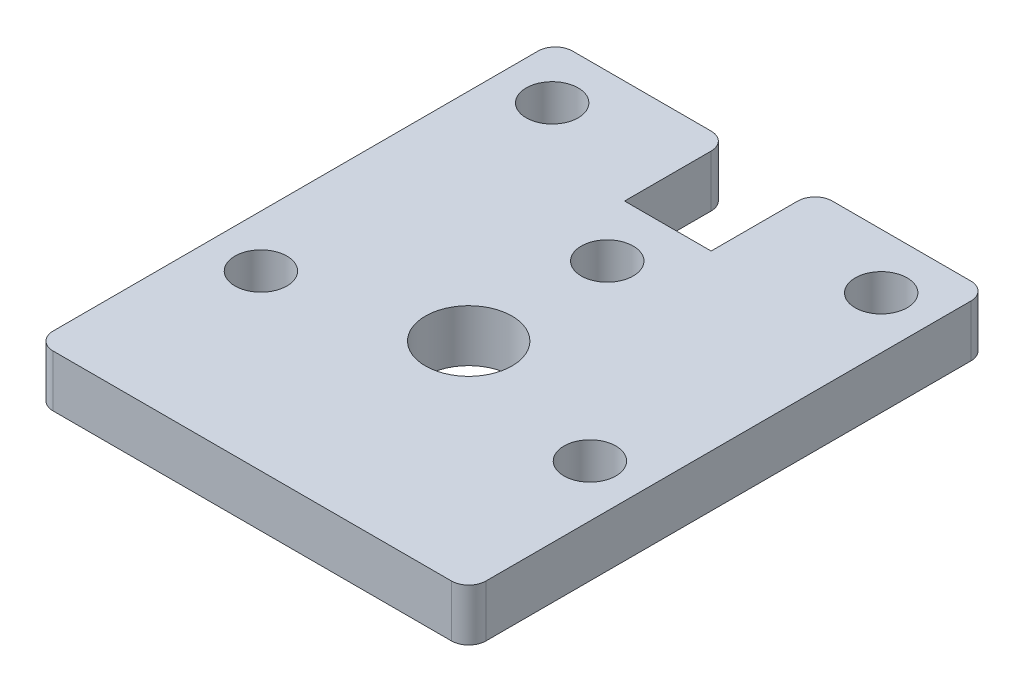
ISO-10303-21;
HEADER;
FILE_DESCRIPTION(('STEP AP214'),'2;1');
FILE_NAME('part.step','',(''),(''),'','','');
FILE_SCHEMA(('AUTOMOTIVE_DESIGN { 1 0 10303 214 1 1 1 1 }'));
ENDSEC;
DATA;
#1=APPLICATION_CONTEXT('core data for automotive mechanical design processes');
#2=APPLICATION_PROTOCOL_DEFINITION('international standard','automotive_design',2000,#1);
#3=PRODUCT_CONTEXT('',#1,'mechanical');
#4=PRODUCT('Part','Part','',(#3));
#5=PRODUCT_RELATED_PRODUCT_CATEGORY('part','',(#4));
#6=PRODUCT_DEFINITION_FORMATION('','',#4);
#7=PRODUCT_DEFINITION_CONTEXT('part definition',#1,'design');
#8=PRODUCT_DEFINITION('design','',#6,#7);
#9=PRODUCT_DEFINITION_SHAPE('','',#8);
#10=(LENGTH_UNIT() NAMED_UNIT(*) SI_UNIT(.MILLI.,.METRE.));
#11=(NAMED_UNIT(*) PLANE_ANGLE_UNIT() SI_UNIT($,.RADIAN.));
#12=(NAMED_UNIT(*) SI_UNIT($,.STERADIAN.) SOLID_ANGLE_UNIT());
#13=UNCERTAINTY_MEASURE_WITH_UNIT(LENGTH_MEASURE(1.E-05),#10,'distance_accuracy_value','');
#14=(GEOMETRIC_REPRESENTATION_CONTEXT(3) GLOBAL_UNCERTAINTY_ASSIGNED_CONTEXT((#13)) GLOBAL_UNIT_ASSIGNED_CONTEXT((#10,
#11,#12)) REPRESENTATION_CONTEXT('',''));
#15=CARTESIAN_POINT('',(0.,0.,0.));
#16=DIRECTION('',(0.,0.,1.));
#17=DIRECTION('',(1.,0.,0.));
#18=AXIS2_PLACEMENT_3D('',#15,#16,#17);
#19=CARTESIAN_POINT('',(0.,3.,0.));
#20=DIRECTION('',(0.,0.,1.));
#21=DIRECTION('',(1.,0.,0.));
#22=AXIS2_PLACEMENT_3D('',#19,#20,#21);
#23=PLANE('',#22);
#24=DIRECTION('',(-1.,0.,0.));
#25=VECTOR('',#24,1.);
#26=CARTESIAN_POINT('',(0.,0.,0.));
#27=LINE('',#26,#25);
#28=CARTESIAN_POINT('',(9.,0.,0.));
#29=VERTEX_POINT('',#28);
#30=CARTESIAN_POINT('',(1.,0.,0.));
#31=VERTEX_POINT('',#30);
#32=EDGE_CURVE('E267',#29,#31,#27,.T.);
#33=ORIENTED_EDGE('',*,*,#32,.T.);
#34=DIRECTION('',(0.,-1.,0.));
#35=VECTOR('',#34,1.);
#36=CARTESIAN_POINT('',(1.,3.,0.));
#37=LINE('',#36,#35);
#38=CARTESIAN_POINT('',(1.,3.,0.));
#39=VERTEX_POINT('',#38);
#40=EDGE_CURVE('E328',#31,#39,#37,.F.);
#41=ORIENTED_EDGE('',*,*,#40,.T.);
#42=DIRECTION('',(-1.,0.,0.));
#43=VECTOR('',#42,1.);
#44=CARTESIAN_POINT('',(0.,3.,0.));
#45=LINE('',#44,#43);
#46=CARTESIAN_POINT('',(9.,3.,0.));
#47=VERTEX_POINT('',#46);
#48=EDGE_CURVE('E251',#47,#39,#45,.T.);
#49=ORIENTED_EDGE('',*,*,#48,.F.);
#50=DIRECTION('',(0.,1.,0.));
#51=VECTOR('',#50,1.);
#52=CARTESIAN_POINT('',(9.,3.,0.));
#53=LINE('',#52,#51);
#54=EDGE_CURVE('E325',#47,#29,#53,.F.);
#55=ORIENTED_EDGE('',*,*,#54,.T.);
#56=EDGE_LOOP('',(#33,#41,#49,#55));
#57=FACE_BOUND('',#56,.T.);
#58=ADVANCED_FACE('F42',(#57),#23,.F.);
#59=CARTESIAN_POINT('',(0.,3.,0.));
#60=DIRECTION('',(0.,1.,0.));
#61=DIRECTION('',(0.,0.,1.));
#62=AXIS2_PLACEMENT_3D('',#59,#60,#61);
#63=PLANE('',#62);
#64=DIRECTION('',(0.,0.,1.));
#65=VECTOR('',#64,1.);
#66=CARTESIAN_POINT('',(0.,3.,0.));
#67=LINE('',#66,#65);
#68=CARTESIAN_POINT('',(0.,3.,1.));
#69=VERTEX_POINT('',#68);
#70=CARTESIAN_POINT('',(0.,3.,29.));
#71=VERTEX_POINT('',#70);
#72=EDGE_CURVE('E238',#69,#71,#67,.T.);
#73=ORIENTED_EDGE('',*,*,#72,.T.);
#74=CARTESIAN_POINT('',(1.,3.,29.));
#75=DIRECTION('',(0.,1.,0.));
#76=DIRECTION('',(0.,0.,1.));
#77=AXIS2_PLACEMENT_3D('',#74,#75,#76);
#78=CIRCLE('',#77,1.);
#79=CARTESIAN_POINT('',(1.,3.,30.));
#80=VERTEX_POINT('',#79);
#81=EDGE_CURVE('E315',#71,#80,#78,.T.);
#82=ORIENTED_EDGE('',*,*,#81,.T.);
#83=DIRECTION('',(1.,0.,0.));
#84=VECTOR('',#83,1.);
#85=CARTESIAN_POINT('',(0.,3.,30.));
#86=LINE('',#85,#84);
#87=CARTESIAN_POINT('',(24.,3.,30.));
#88=VERTEX_POINT('',#87);
#89=EDGE_CURVE('E242',#80,#88,#86,.T.);
#90=ORIENTED_EDGE('',*,*,#89,.T.);
#91=CARTESIAN_POINT('',(24.,3.,29.));
#92=DIRECTION('',(0.,1.,0.));
#93=DIRECTION('',(0.,0.,1.));
#94=AXIS2_PLACEMENT_3D('',#91,#92,#93);
#95=CIRCLE('',#94,1.);
#96=CARTESIAN_POINT('',(25.,3.,29.));
#97=VERTEX_POINT('',#96);
#98=EDGE_CURVE('E312',#88,#97,#95,.T.);
#99=ORIENTED_EDGE('',*,*,#98,.T.);
#100=DIRECTION('',(0.,0.,-1.));
#101=VECTOR('',#100,1.);
#102=CARTESIAN_POINT('',(25.,3.,0.));
#103=LINE('',#102,#101);
#104=CARTESIAN_POINT('',(25.,3.,1.));
#105=VERTEX_POINT('',#104);
#106=EDGE_CURVE('E247',#97,#105,#103,.T.);
#107=ORIENTED_EDGE('',*,*,#106,.T.);
#108=CARTESIAN_POINT('',(24.,3.,1.));
#109=DIRECTION('',(0.,1.,0.));
#110=DIRECTION('',(0.,0.,1.));
#111=AXIS2_PLACEMENT_3D('',#108,#109,#110);
#112=CIRCLE('',#111,1.);
#113=CARTESIAN_POINT('',(24.,3.,0.));
#114=VERTEX_POINT('',#113);
#115=EDGE_CURVE('E301',#105,#114,#112,.T.);
#116=ORIENTED_EDGE('',*,*,#115,.T.);
#117=CARTESIAN_POINT('',(16.,3.,0.));
#118=VERTEX_POINT('',#117);
#119=EDGE_CURVE('E252',#114,#118,#45,.T.);
#120=ORIENTED_EDGE('',*,*,#119,.T.);
#121=CARTESIAN_POINT('',(16.,3.,1.));
#122=DIRECTION('',(0.,1.,0.));
#123=DIRECTION('',(0.,0.,1.));
#124=AXIS2_PLACEMENT_3D('',#121,#122,#123);
#125=CIRCLE('',#124,1.);
#126=CARTESIAN_POINT('',(15.,3.,1.));
#127=VERTEX_POINT('',#126);
#128=EDGE_CURVE('E58',#118,#127,#125,.T.);
#129=ORIENTED_EDGE('',*,*,#128,.T.);
#130=DIRECTION('',(0.,0.,-1.));
#131=VECTOR('',#130,1.);
#132=CARTESIAN_POINT('',(15.,3.,0.));
#133=LINE('',#132,#131);
#134=CARTESIAN_POINT('',(15.,3.,6.));
#135=VERTEX_POINT('',#134);
#136=EDGE_CURVE('E159',#135,#127,#133,.T.);
#137=ORIENTED_EDGE('',*,*,#136,.F.);
#138=DIRECTION('',(1.,0.,0.));
#139=VECTOR('',#138,1.);
#140=CARTESIAN_POINT('',(10.,3.,6.));
#141=LINE('',#140,#139);
#142=CARTESIAN_POINT('',(10.,3.,6.));
#143=VERTEX_POINT('',#142);
#144=EDGE_CURVE('E182',#143,#135,#141,.T.);
#145=ORIENTED_EDGE('',*,*,#144,.F.);
#146=DIRECTION('',(0.,0.,1.));
#147=VECTOR('',#146,1.);
#148=CARTESIAN_POINT('',(10.,3.,0.));
#149=LINE('',#148,#147);
#150=CARTESIAN_POINT('',(10.,3.,0.999999999999999));
#151=VERTEX_POINT('',#150);
#152=EDGE_CURVE('E165',#151,#143,#149,.T.);
#153=ORIENTED_EDGE('',*,*,#152,.F.);
#154=CARTESIAN_POINT('',(9.,3.,1.));
#155=DIRECTION('',(0.,1.,0.));
#156=DIRECTION('',(0.,0.,1.));
#157=AXIS2_PLACEMENT_3D('',#154,#155,#156);
#158=CIRCLE('',#157,1.);
#159=EDGE_CURVE('E306',#151,#47,#158,.T.);
#160=ORIENTED_EDGE('',*,*,#159,.T.);
#161=ORIENTED_EDGE('',*,*,#48,.T.);
#162=CARTESIAN_POINT('',(1.,3.,1.));
#163=DIRECTION('',(0.,1.,0.));
#164=DIRECTION('',(0.,0.,1.));
#165=AXIS2_PLACEMENT_3D('',#162,#163,#164);
#166=CIRCLE('',#165,1.);
#167=EDGE_CURVE('E309',#39,#69,#166,.T.);
#168=ORIENTED_EDGE('',*,*,#167,.T.);
#169=EDGE_LOOP('',(#73,#82,#90,#99,#107,#116,#120,#129,#137,#145,#153,#160,#161,#168));
#170=FACE_BOUND('',#169,.T.);
#171=CARTESIAN_POINT('',(12.5,3.,9.5));
#172=DIRECTION('',(0.,1.,0.));
#173=DIRECTION('',(0.,0.,1.));
#174=AXIS2_PLACEMENT_3D('',#171,#172,#173);
#175=CIRCLE('',#174,1.5);
#176=CARTESIAN_POINT('',(12.5,3.,11.));
#177=VERTEX_POINT('',#176);
#178=EDGE_CURVE('E183',#177,#177,#175,.T.);
#179=ORIENTED_EDGE('',*,*,#178,.F.);
#180=EDGE_LOOP('',(#179));
#181=FACE_BOUND('',#180,.T.);
#182=CARTESIAN_POINT('',(12.5,3.,17.5));
#183=DIRECTION('',(0.,1.,0.));
#184=DIRECTION('',(0.,0.,1.));
#185=AXIS2_PLACEMENT_3D('',#182,#183,#184);
#186=CIRCLE('',#185,2.5);
#187=CARTESIAN_POINT('',(12.5,3.,20.));
#188=VERTEX_POINT('',#187);
#189=EDGE_CURVE('E198',#188,#188,#186,.T.);
#190=ORIENTED_EDGE('',*,*,#189,.F.);
#191=EDGE_LOOP('',(#190));
#192=FACE_BOUND('',#191,.T.);
#193=CARTESIAN_POINT('',(22.,3.,3.18));
#194=DIRECTION('',(0.,1.,0.));
#195=DIRECTION('',(0.,0.,1.));
#196=AXIS2_PLACEMENT_3D('',#193,#194,#195);
#197=CIRCLE('',#196,1.5);
#198=CARTESIAN_POINT('',(22.,3.,4.68));
#199=VERTEX_POINT('',#198);
#200=EDGE_CURVE('E214',#199,#199,#197,.T.);
#201=ORIENTED_EDGE('',*,*,#200,.F.);
#202=EDGE_LOOP('',(#201));
#203=FACE_BOUND('',#202,.T.);
#204=CARTESIAN_POINT('',(3.,3.,20.));
#205=DIRECTION('',(0.,1.,0.));
#206=DIRECTION('',(0.,0.,1.));
#207=AXIS2_PLACEMENT_3D('',#204,#205,#206);
#208=CIRCLE('',#207,1.5);
#209=CARTESIAN_POINT('',(3.,3.,21.5));
#210=VERTEX_POINT('',#209);
#211=EDGE_CURVE('E230',#210,#210,#208,.T.);
#212=ORIENTED_EDGE('',*,*,#211,.F.);
#213=EDGE_LOOP('',(#212));
#214=FACE_BOUND('',#213,.T.);
#215=CARTESIAN_POINT('',(22.,3.,20.));
#216=DIRECTION('',(0.,1.,0.));
#217=DIRECTION('',(0.,0.,1.));
#218=AXIS2_PLACEMENT_3D('',#215,#216,#217);
#219=CIRCLE('',#218,1.5);
#220=CARTESIAN_POINT('',(22.,3.,21.5));
#221=VERTEX_POINT('',#220);
#222=EDGE_CURVE('E222',#221,#221,#219,.T.);
#223=ORIENTED_EDGE('',*,*,#222,.F.);
#224=EDGE_LOOP('',(#223));
#225=FACE_BOUND('',#224,.T.);
#226=CARTESIAN_POINT('',(3.,3.,3.18));
#227=DIRECTION('',(0.,1.,0.));
#228=DIRECTION('',(0.,0.,1.));
#229=AXIS2_PLACEMENT_3D('',#226,#227,#228);
#230=CIRCLE('',#229,1.5);
#231=CARTESIAN_POINT('',(3.,3.,4.68));
#232=VERTEX_POINT('',#231);
#233=EDGE_CURVE('E206',#232,#232,#230,.T.);
#234=ORIENTED_EDGE('',*,*,#233,.F.);
#235=EDGE_LOOP('',(#234));
#236=FACE_BOUND('',#235,.T.);
#237=ADVANCED_FACE('F344',(#170,#181,#192,#203,#214,#225,#236),#63,.T.);
#238=CARTESIAN_POINT('',(0.,0.,0.));
#239=DIRECTION('',(0.,1.,0.));
#240=DIRECTION('',(0.,0.,1.));
#241=AXIS2_PLACEMENT_3D('',#238,#239,#240);
#242=PLANE('',#241);
#243=DIRECTION('',(1.,0.,0.));
#244=VECTOR('',#243,1.);
#245=CARTESIAN_POINT('',(0.,0.,30.));
#246=LINE('',#245,#244);
#247=CARTESIAN_POINT('',(1.,0.,30.));
#248=VERTEX_POINT('',#247);
#249=CARTESIAN_POINT('',(24.,0.,30.));
#250=VERTEX_POINT('',#249);
#251=EDGE_CURVE('E259',#248,#250,#246,.T.);
#252=ORIENTED_EDGE('',*,*,#251,.F.);
#253=CARTESIAN_POINT('',(1.,0.,29.));
#254=DIRECTION('',(0.,1.,0.));
#255=DIRECTION('',(0.,0.,1.));
#256=AXIS2_PLACEMENT_3D('',#253,#254,#255);
#257=CIRCLE('',#256,1.);
#258=CARTESIAN_POINT('',(0.,0.,29.));
#259=VERTEX_POINT('',#258);
#260=EDGE_CURVE('E291',#248,#259,#257,.F.);
#261=ORIENTED_EDGE('',*,*,#260,.T.);
#262=DIRECTION('',(0.,0.,1.));
#263=VECTOR('',#262,1.);
#264=CARTESIAN_POINT('',(0.,0.,0.));
#265=LINE('',#264,#263);
#266=CARTESIAN_POINT('',(0.,0.,1.));
#267=VERTEX_POINT('',#266);
#268=EDGE_CURVE('E234',#267,#259,#265,.T.);
#269=ORIENTED_EDGE('',*,*,#268,.F.);
#270=CARTESIAN_POINT('',(1.,0.,1.));
#271=DIRECTION('',(0.,1.,0.));
#272=DIRECTION('',(0.,0.,1.));
#273=AXIS2_PLACEMENT_3D('',#270,#271,#272);
#274=CIRCLE('',#273,1.);
#275=EDGE_CURVE('E285',#267,#31,#274,.F.);
#276=ORIENTED_EDGE('',*,*,#275,.T.);
#277=ORIENTED_EDGE('',*,*,#32,.F.);
#278=CARTESIAN_POINT('',(9.,0.,1.));
#279=DIRECTION('',(0.,1.,0.));
#280=DIRECTION('',(0.,0.,1.));
#281=AXIS2_PLACEMENT_3D('',#278,#279,#280);
#282=CIRCLE('',#281,1.);
#283=CARTESIAN_POINT('',(10.,0.,0.999999999999999));
#284=VERTEX_POINT('',#283);
#285=EDGE_CURVE('E154',#29,#284,#282,.F.);
#286=ORIENTED_EDGE('',*,*,#285,.T.);
#287=DIRECTION('',(0.,0.,1.));
#288=VECTOR('',#287,1.);
#289=CARTESIAN_POINT('',(10.,0.,0.));
#290=LINE('',#289,#288);
#291=CARTESIAN_POINT('',(10.,0.,6.));
#292=VERTEX_POINT('',#291);
#293=EDGE_CURVE('E144',#284,#292,#290,.T.);
#294=ORIENTED_EDGE('',*,*,#293,.T.);
#295=DIRECTION('',(1.,0.,0.));
#296=VECTOR('',#295,1.);
#297=CARTESIAN_POINT('',(10.,0.,6.));
#298=LINE('',#297,#296);
#299=CARTESIAN_POINT('',(15.,0.,6.));
#300=VERTEX_POINT('',#299);
#301=EDGE_CURVE('E151',#292,#300,#298,.T.);
#302=ORIENTED_EDGE('',*,*,#301,.T.);
#303=DIRECTION('',(0.,0.,-1.));
#304=VECTOR('',#303,1.);
#305=CARTESIAN_POINT('',(15.,0.,0.));
#306=LINE('',#305,#304);
#307=CARTESIAN_POINT('',(15.,0.,1.));
#308=VERTEX_POINT('',#307);
#309=EDGE_CURVE('E171',#300,#308,#306,.T.);
#310=ORIENTED_EDGE('',*,*,#309,.T.);
#311=CARTESIAN_POINT('',(16.,0.,1.));
#312=DIRECTION('',(0.,1.,0.));
#313=DIRECTION('',(0.,0.,1.));
#314=AXIS2_PLACEMENT_3D('',#311,#312,#313);
#315=CIRCLE('',#314,1.);
#316=CARTESIAN_POINT('',(16.,0.,0.));
#317=VERTEX_POINT('',#316);
#318=EDGE_CURVE('E280',#308,#317,#315,.F.);
#319=ORIENTED_EDGE('',*,*,#318,.T.);
#320=CARTESIAN_POINT('',(24.,0.,0.));
#321=VERTEX_POINT('',#320);
#322=EDGE_CURVE('E243',#321,#317,#27,.T.);
#323=ORIENTED_EDGE('',*,*,#322,.F.);
#324=CARTESIAN_POINT('',(24.,0.,1.));
#325=DIRECTION('',(0.,1.,0.));
#326=DIRECTION('',(0.,0.,1.));
#327=AXIS2_PLACEMENT_3D('',#324,#325,#326);
#328=CIRCLE('',#327,1.);
#329=CARTESIAN_POINT('',(25.,0.,1.));
#330=VERTEX_POINT('',#329);
#331=EDGE_CURVE('E277',#321,#330,#328,.F.);
#332=ORIENTED_EDGE('',*,*,#331,.T.);
#333=DIRECTION('',(0.,0.,-1.));
#334=VECTOR('',#333,1.);
#335=CARTESIAN_POINT('',(25.,0.,0.));
#336=LINE('',#335,#334);
#337=CARTESIAN_POINT('',(25.,0.,29.));
#338=VERTEX_POINT('',#337);
#339=EDGE_CURVE('E263',#338,#330,#336,.T.);
#340=ORIENTED_EDGE('',*,*,#339,.F.);
#341=CARTESIAN_POINT('',(24.,0.,29.));
#342=DIRECTION('',(0.,1.,0.));
#343=DIRECTION('',(0.,0.,1.));
#344=AXIS2_PLACEMENT_3D('',#341,#342,#343);
#345=CIRCLE('',#344,1.);
#346=EDGE_CURVE('E288',#338,#250,#345,.F.);
#347=ORIENTED_EDGE('',*,*,#346,.T.);
#348=EDGE_LOOP('',(#252,#261,#269,#276,#277,#286,#294,#302,#310,#319,#323,#332,#340,#347));
#349=FACE_BOUND('',#348,.T.);
#350=CARTESIAN_POINT('',(12.5,0.,9.5));
#351=DIRECTION('',(0.,1.,0.));
#352=DIRECTION('',(0.,0.,1.));
#353=AXIS2_PLACEMENT_3D('',#350,#351,#352);
#354=CIRCLE('',#353,1.5);
#355=CARTESIAN_POINT('',(12.5,0.,11.));
#356=VERTEX_POINT('',#355);
#357=EDGE_CURVE('E194',#356,#356,#354,.T.);
#358=ORIENTED_EDGE('',*,*,#357,.T.);
#359=EDGE_LOOP('',(#358));
#360=FACE_BOUND('',#359,.T.);
#361=CARTESIAN_POINT('',(12.5,0.,17.5));
#362=DIRECTION('',(0.,1.,0.));
#363=DIRECTION('',(0.,0.,1.));
#364=AXIS2_PLACEMENT_3D('',#361,#362,#363);
#365=CIRCLE('',#364,2.5);
#366=CARTESIAN_POINT('',(12.5,0.,20.));
#367=VERTEX_POINT('',#366);
#368=EDGE_CURVE('E202',#367,#367,#365,.T.);
#369=ORIENTED_EDGE('',*,*,#368,.T.);
#370=EDGE_LOOP('',(#369));
#371=FACE_BOUND('',#370,.T.);
#372=CARTESIAN_POINT('',(3.,0.,20.));
#373=DIRECTION('',(0.,1.,0.));
#374=DIRECTION('',(0.,0.,1.));
#375=AXIS2_PLACEMENT_3D('',#372,#373,#374);
#376=CIRCLE('',#375,1.5);
#377=CARTESIAN_POINT('',(3.,0.,21.5));
#378=VERTEX_POINT('',#377);
#379=EDGE_CURVE('E226',#378,#378,#376,.T.);
#380=ORIENTED_EDGE('',*,*,#379,.T.);
#381=EDGE_LOOP('',(#380));
#382=FACE_BOUND('',#381,.T.);
#383=CARTESIAN_POINT('',(22.,0.,20.));
#384=DIRECTION('',(0.,1.,0.));
#385=DIRECTION('',(0.,0.,1.));
#386=AXIS2_PLACEMENT_3D('',#383,#384,#385);
#387=CIRCLE('',#386,1.5);
#388=CARTESIAN_POINT('',(22.,0.,21.5));
#389=VERTEX_POINT('',#388);
#390=EDGE_CURVE('E218',#389,#389,#387,.T.);
#391=ORIENTED_EDGE('',*,*,#390,.T.);
#392=EDGE_LOOP('',(#391));
#393=FACE_BOUND('',#392,.T.);
#394=CARTESIAN_POINT('',(22.,0.,3.18));
#395=DIRECTION('',(0.,1.,0.));
#396=DIRECTION('',(0.,0.,1.));
#397=AXIS2_PLACEMENT_3D('',#394,#395,#396);
#398=CIRCLE('',#397,1.5);
#399=CARTESIAN_POINT('',(22.,0.,4.68));
#400=VERTEX_POINT('',#399);
#401=EDGE_CURVE('E210',#400,#400,#398,.T.);
#402=ORIENTED_EDGE('',*,*,#401,.T.);
#403=EDGE_LOOP('',(#402));
#404=FACE_BOUND('',#403,.T.);
#405=CARTESIAN_POINT('',(3.,0.,3.18));
#406=DIRECTION('',(0.,1.,0.));
#407=DIRECTION('',(0.,0.,1.));
#408=AXIS2_PLACEMENT_3D('',#405,#406,#407);
#409=CIRCLE('',#408,1.5);
#410=CARTESIAN_POINT('',(3.,0.,4.68));
#411=VERTEX_POINT('',#410);
#412=EDGE_CURVE('E189',#411,#411,#409,.T.);
#413=ORIENTED_EDGE('',*,*,#412,.T.);
#414=EDGE_LOOP('',(#413));
#415=FACE_BOUND('',#414,.T.);
#416=ADVANCED_FACE('F147',(#349,#360,#371,#382,#393,#404,#415),#242,.F.);
#417=CARTESIAN_POINT('',(0.,3.,0.));
#418=DIRECTION('',(1.,0.,0.));
#419=DIRECTION('',(0.,0.,-1.));
#420=AXIS2_PLACEMENT_3D('',#417,#418,#419);
#421=PLANE('',#420);
#422=ORIENTED_EDGE('',*,*,#268,.T.);
#423=DIRECTION('',(0.,-1.,0.));
#424=VECTOR('',#423,1.);
#425=CARTESIAN_POINT('',(0.,3.,29.));
#426=LINE('',#425,#424);
#427=EDGE_CURVE('E298',#259,#71,#426,.F.);
#428=ORIENTED_EDGE('',*,*,#427,.T.);
#429=ORIENTED_EDGE('',*,*,#72,.F.);
#430=DIRECTION('',(0.,-1.,0.));
#431=VECTOR('',#430,1.);
#432=CARTESIAN_POINT('',(0.,3.,1.));
#433=LINE('',#432,#431);
#434=EDGE_CURVE('E294',#69,#267,#433,.T.);
#435=ORIENTED_EDGE('',*,*,#434,.T.);
#436=EDGE_LOOP('',(#422,#428,#429,#435));
#437=FACE_BOUND('',#436,.T.);
#438=ADVANCED_FACE('F399',(#437),#421,.F.);
#439=CARTESIAN_POINT('',(0.,3.,30.));
#440=DIRECTION('',(0.,0.,-1.));
#441=DIRECTION('',(-1.,0.,0.));
#442=AXIS2_PLACEMENT_3D('',#439,#440,#441);
#443=PLANE('',#442);
#444=ORIENTED_EDGE('',*,*,#89,.F.);
#445=DIRECTION('',(0.,-1.,0.));
#446=VECTOR('',#445,1.);
#447=CARTESIAN_POINT('',(1.,3.,30.));
#448=LINE('',#447,#446);
#449=EDGE_CURVE('E273',#80,#248,#448,.T.);
#450=ORIENTED_EDGE('',*,*,#449,.T.);
#451=ORIENTED_EDGE('',*,*,#251,.T.);
#452=DIRECTION('',(0.,-1.,0.));
#453=VECTOR('',#452,1.);
#454=CARTESIAN_POINT('',(24.,3.,30.));
#455=LINE('',#454,#453);
#456=EDGE_CURVE('E255',#250,#88,#455,.F.);
#457=ORIENTED_EDGE('',*,*,#456,.T.);
#458=EDGE_LOOP('',(#444,#450,#451,#457));
#459=FACE_BOUND('',#458,.T.);
#460=ADVANCED_FACE('F394',(#459),#443,.F.);
#461=CARTESIAN_POINT('',(25.,3.,0.));
#462=DIRECTION('',(-1.,0.,0.));
#463=DIRECTION('',(0.,0.,1.));
#464=AXIS2_PLACEMENT_3D('',#461,#462,#463);
#465=PLANE('',#464);
#466=ORIENTED_EDGE('',*,*,#106,.F.);
#467=DIRECTION('',(0.,-1.,0.));
#468=VECTOR('',#467,1.);
#469=CARTESIAN_POINT('',(25.,3.,29.));
#470=LINE('',#469,#468);
#471=EDGE_CURVE('E321',#97,#338,#470,.T.);
#472=ORIENTED_EDGE('',*,*,#471,.T.);
#473=ORIENTED_EDGE('',*,*,#339,.T.);
#474=DIRECTION('',(0.,-1.,0.));
#475=VECTOR('',#474,1.);
#476=CARTESIAN_POINT('',(25.,3.,1.));
#477=LINE('',#476,#475);
#478=EDGE_CURVE('E318',#330,#105,#477,.F.);
#479=ORIENTED_EDGE('',*,*,#478,.T.);
#480=EDGE_LOOP('',(#466,#472,#473,#479));
#481=FACE_BOUND('',#480,.T.);
#482=ADVANCED_FACE('F385',(#481),#465,.F.);
#483=ORIENTED_EDGE('',*,*,#322,.T.);
#484=DIRECTION('',(0.,1.,0.));
#485=VECTOR('',#484,1.);
#486=CARTESIAN_POINT('',(16.,3.,0.));
#487=LINE('',#486,#485);
#488=EDGE_CURVE('E51',#317,#118,#487,.T.);
#489=ORIENTED_EDGE('',*,*,#488,.T.);
#490=ORIENTED_EDGE('',*,*,#119,.F.);
#491=DIRECTION('',(0.,-1.,0.));
#492=VECTOR('',#491,1.);
#493=CARTESIAN_POINT('',(24.,3.,0.));
#494=LINE('',#493,#492);
#495=EDGE_CURVE('E334',#114,#321,#494,.T.);
#496=ORIENTED_EDGE('',*,*,#495,.T.);
#497=EDGE_LOOP('',(#483,#489,#490,#496));
#498=FACE_BOUND('',#497,.T.);
#499=ADVANCED_FACE('F340',(#498),#23,.F.);
#500=CARTESIAN_POINT('',(3.,3.,20.));
#501=DIRECTION('',(0.,-1.,0.));
#502=DIRECTION('',(0.,0.,-1.));
#503=AXIS2_PLACEMENT_3D('',#500,#501,#502);
#504=CYLINDRICAL_SURFACE('',#503,1.5);
#505=ORIENTED_EDGE('',*,*,#211,.T.);
#506=EDGE_LOOP('',(#505));
#507=FACE_BOUND('',#506,.T.);
#508=ORIENTED_EDGE('',*,*,#379,.F.);
#509=EDGE_LOOP('',(#508));
#510=FACE_BOUND('',#509,.T.);
#511=ADVANCED_FACE('F384',(#507,#510),#504,.F.);
#512=CARTESIAN_POINT('',(22.,3.,20.));
#513=DIRECTION('',(0.,-1.,0.));
#514=DIRECTION('',(0.,0.,-1.));
#515=AXIS2_PLACEMENT_3D('',#512,#513,#514);
#516=CYLINDRICAL_SURFACE('',#515,1.5);
#517=ORIENTED_EDGE('',*,*,#222,.T.);
#518=EDGE_LOOP('',(#517));
#519=FACE_BOUND('',#518,.T.);
#520=ORIENTED_EDGE('',*,*,#390,.F.);
#521=EDGE_LOOP('',(#520));
#522=FACE_BOUND('',#521,.T.);
#523=ADVANCED_FACE('F391',(#519,#522),#516,.F.);
#524=CARTESIAN_POINT('',(22.,3.,3.18));
#525=DIRECTION('',(0.,-1.,0.));
#526=DIRECTION('',(0.,0.,-1.));
#527=AXIS2_PLACEMENT_3D('',#524,#525,#526);
#528=CYLINDRICAL_SURFACE('',#527,1.5);
#529=ORIENTED_EDGE('',*,*,#200,.T.);
#530=EDGE_LOOP('',(#529));
#531=FACE_BOUND('',#530,.T.);
#532=ORIENTED_EDGE('',*,*,#401,.F.);
#533=EDGE_LOOP('',(#532));
#534=FACE_BOUND('',#533,.T.);
#535=ADVANCED_FACE('F524',(#531,#534),#528,.F.);
#536=CARTESIAN_POINT('',(3.,3.,3.18));
#537=DIRECTION('',(0.,-1.,0.));
#538=DIRECTION('',(0.,0.,-1.));
#539=AXIS2_PLACEMENT_3D('',#536,#537,#538);
#540=CYLINDRICAL_SURFACE('',#539,1.5);
#541=ORIENTED_EDGE('',*,*,#233,.T.);
#542=EDGE_LOOP('',(#541));
#543=FACE_BOUND('',#542,.T.);
#544=ORIENTED_EDGE('',*,*,#412,.F.);
#545=EDGE_LOOP('',(#544));
#546=FACE_BOUND('',#545,.T.);
#547=ADVANCED_FACE('F508',(#543,#546),#540,.F.);
#548=CARTESIAN_POINT('',(10.,0.,0.));
#549=DIRECTION('',(-1.,0.,0.));
#550=DIRECTION('',(0.,0.,1.));
#551=AXIS2_PLACEMENT_3D('',#548,#549,#550);
#552=PLANE('',#551);
#553=ORIENTED_EDGE('',*,*,#293,.F.);
#554=DIRECTION('',(0.,1.,0.));
#555=VECTOR('',#554,1.);
#556=CARTESIAN_POINT('',(10.,0.,1.));
#557=LINE('',#556,#555);
#558=EDGE_CURVE('E331',#284,#151,#557,.T.);
#559=ORIENTED_EDGE('',*,*,#558,.T.);
#560=ORIENTED_EDGE('',*,*,#152,.T.);
#561=DIRECTION('',(0.,1.,0.));
#562=VECTOR('',#561,1.);
#563=CARTESIAN_POINT('',(10.,0.,6.));
#564=LINE('',#563,#562);
#565=EDGE_CURVE('E162',#292,#143,#564,.T.);
#566=ORIENTED_EDGE('',*,*,#565,.F.);
#567=EDGE_LOOP('',(#553,#559,#560,#566));
#568=FACE_BOUND('',#567,.T.);
#569=ADVANCED_FACE('F163',(#568),#552,.F.);
#570=CARTESIAN_POINT('',(15.,0.,0.));
#571=DIRECTION('',(1.,0.,0.));
#572=DIRECTION('',(0.,0.,-1.));
#573=AXIS2_PLACEMENT_3D('',#570,#571,#572);
#574=PLANE('',#573);
#575=ORIENTED_EDGE('',*,*,#136,.T.);
#576=DIRECTION('',(0.,1.,0.));
#577=VECTOR('',#576,1.);
#578=CARTESIAN_POINT('',(15.,0.,1.));
#579=LINE('',#578,#577);
#580=EDGE_CURVE('E11',#127,#308,#579,.F.);
#581=ORIENTED_EDGE('',*,*,#580,.T.);
#582=ORIENTED_EDGE('',*,*,#309,.F.);
#583=DIRECTION('',(0.,1.,0.));
#584=VECTOR('',#583,1.);
#585=CARTESIAN_POINT('',(15.,0.,6.));
#586=LINE('',#585,#584);
#587=EDGE_CURVE('E170',#300,#135,#586,.T.);
#588=ORIENTED_EDGE('',*,*,#587,.T.);
#589=EDGE_LOOP('',(#575,#581,#582,#588));
#590=FACE_BOUND('',#589,.T.);
#591=ADVANCED_FACE('F353',(#590),#574,.F.);
#592=CARTESIAN_POINT('',(10.,0.,6.));
#593=DIRECTION('',(0.,0.,1.));
#594=DIRECTION('',(1.,0.,0.));
#595=AXIS2_PLACEMENT_3D('',#592,#593,#594);
#596=PLANE('',#595);
#597=ORIENTED_EDGE('',*,*,#144,.T.);
#598=ORIENTED_EDGE('',*,*,#587,.F.);
#599=ORIENTED_EDGE('',*,*,#301,.F.);
#600=ORIENTED_EDGE('',*,*,#565,.T.);
#601=EDGE_LOOP('',(#597,#598,#599,#600));
#602=FACE_BOUND('',#601,.T.);
#603=ADVANCED_FACE('F173',(#602),#596,.F.);
#604=CARTESIAN_POINT('',(12.5,0.,17.5));
#605=DIRECTION('',(0.,1.,0.));
#606=DIRECTION('',(0.,0.,1.));
#607=AXIS2_PLACEMENT_3D('',#604,#605,#606);
#608=CYLINDRICAL_SURFACE('',#607,2.5);
#609=ORIENTED_EDGE('',*,*,#368,.F.);
#610=EDGE_LOOP('',(#609));
#611=FACE_BOUND('',#610,.T.);
#612=ORIENTED_EDGE('',*,*,#189,.T.);
#613=EDGE_LOOP('',(#612));
#614=FACE_BOUND('',#613,.T.);
#615=ADVANCED_FACE('F475',(#611,#614),#608,.F.);
#616=CARTESIAN_POINT('',(12.5,0.,9.5));
#617=DIRECTION('',(0.,1.,0.));
#618=DIRECTION('',(0.,0.,1.));
#619=AXIS2_PLACEMENT_3D('',#616,#617,#618);
#620=CYLINDRICAL_SURFACE('',#619,1.5);
#621=ORIENTED_EDGE('',*,*,#357,.F.);
#622=EDGE_LOOP('',(#621));
#623=FACE_BOUND('',#622,.T.);
#624=ORIENTED_EDGE('',*,*,#178,.T.);
#625=EDGE_LOOP('',(#624));
#626=FACE_BOUND('',#625,.T.);
#627=ADVANCED_FACE('F409',(#623,#626),#620,.F.);
#628=CARTESIAN_POINT('',(1.,3.,29.));
#629=DIRECTION('',(0.,-1.,0.));
#630=DIRECTION('',(0.,0.,-1.));
#631=AXIS2_PLACEMENT_3D('',#628,#629,#630);
#632=CYLINDRICAL_SURFACE('',#631,1.);
#633=ORIENTED_EDGE('',*,*,#81,.F.);
#634=ORIENTED_EDGE('',*,*,#427,.F.);
#635=ORIENTED_EDGE('',*,*,#260,.F.);
#636=ORIENTED_EDGE('',*,*,#449,.F.);
#637=EDGE_LOOP('',(#633,#634,#635,#636));
#638=FACE_BOUND('',#637,.T.);
#639=ADVANCED_FACE('F406',(#638),#632,.T.);
#640=CARTESIAN_POINT('',(24.,3.,29.));
#641=DIRECTION('',(0.,-1.,0.));
#642=DIRECTION('',(0.,0.,-1.));
#643=AXIS2_PLACEMENT_3D('',#640,#641,#642);
#644=CYLINDRICAL_SURFACE('',#643,1.);
#645=ORIENTED_EDGE('',*,*,#98,.F.);
#646=ORIENTED_EDGE('',*,*,#456,.F.);
#647=ORIENTED_EDGE('',*,*,#346,.F.);
#648=ORIENTED_EDGE('',*,*,#471,.F.);
#649=EDGE_LOOP('',(#645,#646,#647,#648));
#650=FACE_BOUND('',#649,.T.);
#651=ADVANCED_FACE('F371',(#650),#644,.T.);
#652=CARTESIAN_POINT('',(1.,3.,1.));
#653=DIRECTION('',(0.,-1.,0.));
#654=DIRECTION('',(0.,0.,-1.));
#655=AXIS2_PLACEMENT_3D('',#652,#653,#654);
#656=CYLINDRICAL_SURFACE('',#655,1.);
#657=ORIENTED_EDGE('',*,*,#167,.F.);
#658=ORIENTED_EDGE('',*,*,#40,.F.);
#659=ORIENTED_EDGE('',*,*,#275,.F.);
#660=ORIENTED_EDGE('',*,*,#434,.F.);
#661=EDGE_LOOP('',(#657,#658,#659,#660));
#662=FACE_BOUND('',#661,.T.);
#663=ADVANCED_FACE('F365',(#662),#656,.T.);
#664=CARTESIAN_POINT('',(9.,0.,1.));
#665=DIRECTION('',(0.,1.,0.));
#666=DIRECTION('',(0.,0.,1.));
#667=AXIS2_PLACEMENT_3D('',#664,#665,#666);
#668=CYLINDRICAL_SURFACE('',#667,1.);
#669=ORIENTED_EDGE('',*,*,#285,.F.);
#670=ORIENTED_EDGE('',*,*,#54,.F.);
#671=ORIENTED_EDGE('',*,*,#159,.F.);
#672=ORIENTED_EDGE('',*,*,#558,.F.);
#673=EDGE_LOOP('',(#669,#670,#671,#672));
#674=FACE_BOUND('',#673,.T.);
#675=ADVANCED_FACE('F363',(#674),#668,.T.);
#676=CARTESIAN_POINT('',(16.,3.,1.));
#677=DIRECTION('',(0.,1.,0.));
#678=DIRECTION('',(0.,0.,1.));
#679=AXIS2_PLACEMENT_3D('',#676,#677,#678);
#680=CYLINDRICAL_SURFACE('',#679,1.);
#681=ORIENTED_EDGE('',*,*,#318,.F.);
#682=ORIENTED_EDGE('',*,*,#580,.F.);
#683=ORIENTED_EDGE('',*,*,#128,.F.);
#684=ORIENTED_EDGE('',*,*,#488,.F.);
#685=EDGE_LOOP('',(#681,#682,#683,#684));
#686=FACE_BOUND('',#685,.T.);
#687=ADVANCED_FACE('F351',(#686),#680,.T.);
#688=CARTESIAN_POINT('',(24.,3.,1.));
#689=DIRECTION('',(0.,-1.,0.));
#690=DIRECTION('',(0.,0.,-1.));
#691=AXIS2_PLACEMENT_3D('',#688,#689,#690);
#692=CYLINDRICAL_SURFACE('',#691,1.);
#693=ORIENTED_EDGE('',*,*,#115,.F.);
#694=ORIENTED_EDGE('',*,*,#478,.F.);
#695=ORIENTED_EDGE('',*,*,#331,.F.);
#696=ORIENTED_EDGE('',*,*,#495,.F.);
#697=EDGE_LOOP('',(#693,#694,#695,#696));
#698=FACE_BOUND('',#697,.T.);
#699=ADVANCED_FACE('F44',(#698),#692,.T.);
#700=CLOSED_SHELL('',(#58,#237,#416,#438,#460,#482,#499,#511,#523,#535,#547,#569,#591,#603,#615,
#627,#639,#651,#663,#675,#687,#699));
#701=MANIFOLD_SOLID_BREP('B2',#700);
#702=ADVANCED_BREP_SHAPE_REPRESENTATION('',(#18,#701),#14);
#703=SHAPE_DEFINITION_REPRESENTATION(#9,#702);
ENDSEC;
END-ISO-10303-21;
